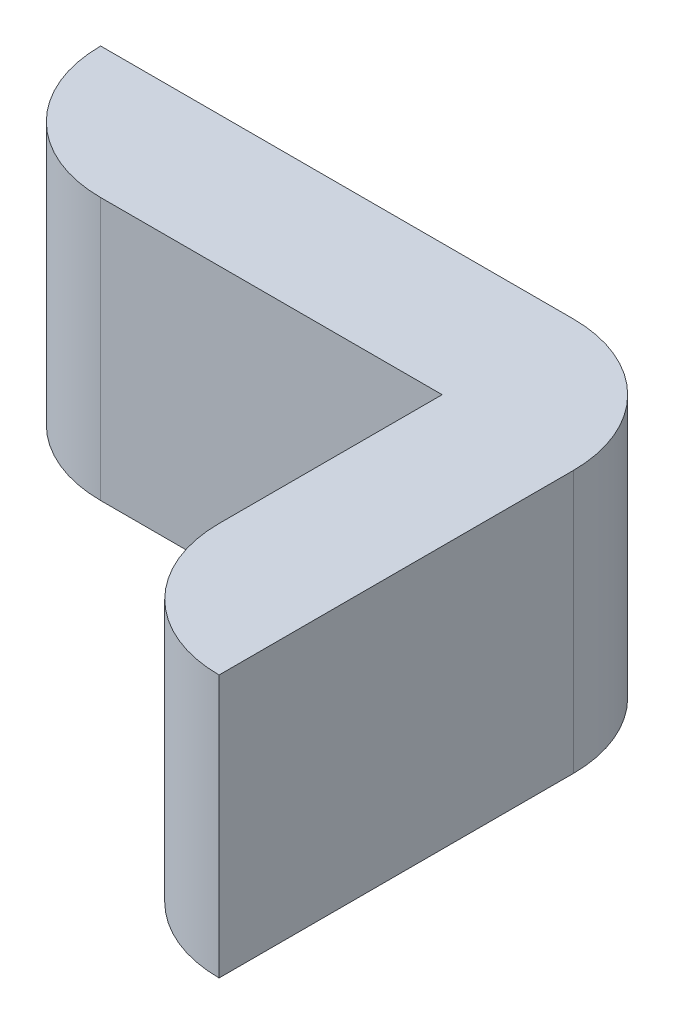
ISO-10303-21;
HEADER;
FILE_DESCRIPTION(('STEP AP214'),'2;1');
FILE_NAME('part.step','',(''),(''),'','','');
FILE_SCHEMA(('AUTOMOTIVE_DESIGN { 1 0 10303 214 1 1 1 1 }'));
ENDSEC;
DATA;
#1=APPLICATION_CONTEXT('core data for automotive mechanical design processes');
#2=APPLICATION_PROTOCOL_DEFINITION('international standard','automotive_design',2000,#1);
#3=PRODUCT_CONTEXT('',#1,'mechanical');
#4=PRODUCT('Part','Part','',(#3));
#5=PRODUCT_RELATED_PRODUCT_CATEGORY('part','',(#4));
#6=PRODUCT_DEFINITION_FORMATION('','',#4);
#7=PRODUCT_DEFINITION_CONTEXT('part definition',#1,'design');
#8=PRODUCT_DEFINITION('design','',#6,#7);
#9=PRODUCT_DEFINITION_SHAPE('','',#8);
#10=(LENGTH_UNIT() NAMED_UNIT(*) SI_UNIT(.MILLI.,.METRE.));
#11=(NAMED_UNIT(*) PLANE_ANGLE_UNIT() SI_UNIT($,.RADIAN.));
#12=(NAMED_UNIT(*) SI_UNIT($,.STERADIAN.) SOLID_ANGLE_UNIT());
#13=UNCERTAINTY_MEASURE_WITH_UNIT(LENGTH_MEASURE(1.E-05),#10,'distance_accuracy_value','');
#14=(GEOMETRIC_REPRESENTATION_CONTEXT(3) GLOBAL_UNCERTAINTY_ASSIGNED_CONTEXT((#13)) GLOBAL_UNIT_ASSIGNED_CONTEXT((#10,
#11,#12)) REPRESENTATION_CONTEXT('',''));
#15=CARTESIAN_POINT('',(0.,0.,0.));
#16=DIRECTION('',(0.,0.,1.));
#17=DIRECTION('',(1.,0.,0.));
#18=AXIS2_PLACEMENT_3D('',#15,#16,#17);
#19=CARTESIAN_POINT('',(0.521041119299,1.0414,0.4699));
#20=DIRECTION('',(-1.,0.,0.));
#21=DIRECTION('',(0.,0.,1.));
#22=AXIS2_PLACEMENT_3D('',#19,#20,#21);
#23=PLANE('',#22);
#24=DIRECTION('',(0.,0.,-1.));
#25=VECTOR('',#24,1.);
#26=CARTESIAN_POINT('',(0.521041119299,1.0414,0.));
#27=LINE('',#26,#25);
#28=CARTESIAN_POINT('',(0.521041119299,1.0414,0.127));
#29=VERTEX_POINT('',#28);
#30=CARTESIAN_POINT('',(0.521041119299,1.0414,0.4699));
#31=VERTEX_POINT('',#30);
#32=EDGE_CURVE('E129',#29,#31,#27,.F.);
#33=ORIENTED_EDGE('',*,*,#32,.F.);
#34=DIRECTION('',(0.,-1.,0.));
#35=VECTOR('',#34,1.);
#36=CARTESIAN_POINT('',(0.521041119299,1.0414,0.127));
#37=LINE('',#36,#35);
#38=CARTESIAN_POINT('',(0.521041119299,1.2954,0.127));
#39=VERTEX_POINT('',#38);
#40=EDGE_CURVE('E82',#39,#29,#37,.T.);
#41=ORIENTED_EDGE('',*,*,#40,.F.);
#42=DIRECTION('',(0.,0.,-1.));
#43=VECTOR('',#42,1.);
#44=CARTESIAN_POINT('',(0.521041119299,1.2954,0.));
#45=LINE('',#44,#43);
#46=CARTESIAN_POINT('',(0.521041119299,1.2954,0.4699));
#47=VERTEX_POINT('',#46);
#48=EDGE_CURVE('E77',#39,#47,#45,.F.);
#49=ORIENTED_EDGE('',*,*,#48,.T.);
#50=DIRECTION('',(0.,-1.,0.));
#51=VECTOR('',#50,1.);
#52=CARTESIAN_POINT('',(0.521041119299,1.0414,0.4699));
#53=LINE('',#52,#51);
#54=EDGE_CURVE('E123',#31,#47,#53,.F.);
#55=ORIENTED_EDGE('',*,*,#54,.F.);
#56=EDGE_LOOP('',(#33,#41,#49,#55));
#57=FACE_BOUND('',#56,.T.);
#58=ADVANCED_FACE('F17',(#57),#23,.F.);
#59=CARTESIAN_POINT('',(0.521041119299,1.0414,0.3429));
#60=DIRECTION('',(0.,-1.,0.));
#61=DIRECTION('',(0.,0.,-1.));
#62=AXIS2_PLACEMENT_3D('',#59,#60,#61);
#63=CYLINDRICAL_SURFACE('',#62,0.127);
#64=CARTESIAN_POINT('',(0.521041119299,1.2954,0.3429));
#65=DIRECTION('',(0.,-1.,0.));
#66=DIRECTION('',(0.,0.,-1.));
#67=AXIS2_PLACEMENT_3D('',#64,#65,#66);
#68=CIRCLE('',#67,0.127);
#69=CARTESIAN_POINT('',(0.394041119299,1.2954,0.3429));
#70=VERTEX_POINT('',#69);
#71=EDGE_CURVE('E107',#47,#70,#68,.T.);
#72=ORIENTED_EDGE('',*,*,#71,.T.);
#73=DIRECTION('',(0.,1.,0.));
#74=VECTOR('',#73,1.);
#75=CARTESIAN_POINT('',(0.394041119299,1.0414,0.3429));
#76=LINE('',#75,#74);
#77=CARTESIAN_POINT('',(0.394041119299,1.0414,0.3429));
#78=VERTEX_POINT('',#77);
#79=EDGE_CURVE('E118',#70,#78,#76,.F.);
#80=ORIENTED_EDGE('',*,*,#79,.T.);
#81=CARTESIAN_POINT('',(0.521041119299,1.0414,0.3429));
#82=DIRECTION('',(0.,-1.,0.));
#83=DIRECTION('',(0.,0.,-1.));
#84=AXIS2_PLACEMENT_3D('',#81,#82,#83);
#85=CIRCLE('',#84,0.127);
#86=EDGE_CURVE('E126',#31,#78,#85,.T.);
#87=ORIENTED_EDGE('',*,*,#86,.F.);
#88=ORIENTED_EDGE('',*,*,#54,.T.);
#89=EDGE_LOOP('',(#72,#80,#87,#88));
#90=FACE_BOUND('',#89,.T.);
#91=ADVANCED_FACE('F133',(#90),#63,.T.);
#92=CARTESIAN_POINT('',(0.394041119299,1.0414,0.127));
#93=DIRECTION('',(1.,0.,0.));
#94=DIRECTION('',(0.,0.,-1.));
#95=AXIS2_PLACEMENT_3D('',#92,#93,#94);
#96=PLANE('',#95);
#97=ORIENTED_EDGE('',*,*,#79,.F.);
#98=DIRECTION('',(0.,0.,-1.));
#99=VECTOR('',#98,1.);
#100=CARTESIAN_POINT('',(0.394041119299,1.2954,0.));
#101=LINE('',#100,#99);
#102=CARTESIAN_POINT('',(0.394041119299,1.2954,0.127));
#103=VERTEX_POINT('',#102);
#104=EDGE_CURVE('E102',#70,#103,#101,.T.);
#105=ORIENTED_EDGE('',*,*,#104,.T.);
#106=DIRECTION('',(0.,1.,0.));
#107=VECTOR('',#106,1.);
#108=CARTESIAN_POINT('',(0.394041119299,1.0414,0.127));
#109=LINE('',#108,#107);
#110=CARTESIAN_POINT('',(0.394041119299,1.0414,0.127));
#111=VERTEX_POINT('',#110);
#112=EDGE_CURVE('E115',#103,#111,#109,.F.);
#113=ORIENTED_EDGE('',*,*,#112,.T.);
#114=DIRECTION('',(0.,0.,-1.));
#115=VECTOR('',#114,1.);
#116=CARTESIAN_POINT('',(0.394041119299,1.0414,0.));
#117=LINE('',#116,#115);
#118=EDGE_CURVE('E128',#78,#111,#117,.T.);
#119=ORIENTED_EDGE('',*,*,#118,.F.);
#120=EDGE_LOOP('',(#97,#105,#113,#119));
#121=FACE_BOUND('',#120,.T.);
#122=ADVANCED_FACE('F158',(#121),#96,.F.);
#123=CARTESIAN_POINT('',(0.0635,1.0414,0.127));
#124=DIRECTION('',(0.,0.,-1.));
#125=DIRECTION('',(-1.,0.,0.));
#126=AXIS2_PLACEMENT_3D('',#123,#124,#125);
#127=PLANE('',#126);
#128=ORIENTED_EDGE('',*,*,#112,.F.);
#129=DIRECTION('',(1.,0.,0.));
#130=VECTOR('',#129,1.);
#131=CARTESIAN_POINT('',(-0.0635,1.2954,0.127));
#132=LINE('',#131,#130);
#133=CARTESIAN_POINT('',(0.0635,1.2954,0.127));
#134=VERTEX_POINT('',#133);
#135=EDGE_CURVE('E98',#103,#134,#132,.F.);
#136=ORIENTED_EDGE('',*,*,#135,.T.);
#137=DIRECTION('',(0.,-1.,0.));
#138=VECTOR('',#137,1.);
#139=CARTESIAN_POINT('',(0.0635,1.0414,0.127));
#140=LINE('',#139,#138);
#141=CARTESIAN_POINT('',(0.0635,1.0414,0.127));
#142=VERTEX_POINT('',#141);
#143=EDGE_CURVE('E101',#142,#134,#140,.F.);
#144=ORIENTED_EDGE('',*,*,#143,.F.);
#145=DIRECTION('',(1.,0.,0.));
#146=VECTOR('',#145,1.);
#147=CARTESIAN_POINT('',(-0.0635,1.0414,0.127));
#148=LINE('',#147,#146);
#149=EDGE_CURVE('E94',#111,#142,#148,.F.);
#150=ORIENTED_EDGE('',*,*,#149,.F.);
#151=EDGE_LOOP('',(#128,#136,#144,#150));
#152=FACE_BOUND('',#151,.T.);
#153=ADVANCED_FACE('F156',(#152),#127,.F.);
#154=CARTESIAN_POINT('',(0.394041119299,1.0414,0.127));
#155=DIRECTION('',(0.,-1.,0.));
#156=DIRECTION('',(0.,0.,-1.));
#157=AXIS2_PLACEMENT_3D('',#154,#155,#156);
#158=CYLINDRICAL_SURFACE('',#157,0.127);
#159=CARTESIAN_POINT('',(0.394041119299,1.2954,0.127));
#160=DIRECTION('',(0.,-1.,0.));
#161=DIRECTION('',(0.,0.,-1.));
#162=AXIS2_PLACEMENT_3D('',#159,#160,#161);
#163=CIRCLE('',#162,0.127);
#164=CARTESIAN_POINT('',(0.394041119299,1.2954,0.));
#165=VERTEX_POINT('',#164);
#166=EDGE_CURVE('E20',#165,#39,#163,.T.);
#167=ORIENTED_EDGE('',*,*,#166,.T.);
#168=ORIENTED_EDGE('',*,*,#40,.T.);
#169=CARTESIAN_POINT('',(0.394041119299,1.0414,0.127));
#170=DIRECTION('',(0.,-1.,0.));
#171=DIRECTION('',(0.,0.,-1.));
#172=AXIS2_PLACEMENT_3D('',#169,#170,#171);
#173=CIRCLE('',#172,0.127);
#174=CARTESIAN_POINT('',(0.394041119299,1.0414,0.));
#175=VERTEX_POINT('',#174);
#176=EDGE_CURVE('E92',#175,#29,#173,.T.);
#177=ORIENTED_EDGE('',*,*,#176,.F.);
#178=DIRECTION('',(0.,1.,0.));
#179=VECTOR('',#178,1.);
#180=CARTESIAN_POINT('',(0.394041119299,1.0414,0.));
#181=LINE('',#180,#179);
#182=EDGE_CURVE('E86',#175,#165,#181,.T.);
#183=ORIENTED_EDGE('',*,*,#182,.T.);
#184=EDGE_LOOP('',(#167,#168,#177,#183));
#185=FACE_BOUND('',#184,.T.);
#186=ADVANCED_FACE('F90',(#185),#158,.T.);
#187=CARTESIAN_POINT('',(-0.0635,1.2954,0.));
#188=DIRECTION('',(0.,-1.,0.));
#189=DIRECTION('',(0.,0.,-1.));
#190=AXIS2_PLACEMENT_3D('',#187,#188,#189);
#191=PLANE('',#190);
#192=ORIENTED_EDGE('',*,*,#135,.F.);
#193=ORIENTED_EDGE('',*,*,#104,.F.);
#194=ORIENTED_EDGE('',*,*,#71,.F.);
#195=ORIENTED_EDGE('',*,*,#48,.F.);
#196=ORIENTED_EDGE('',*,*,#166,.F.);
#197=DIRECTION('',(1.,0.,0.));
#198=VECTOR('',#197,1.);
#199=CARTESIAN_POINT('',(0.394041119299,1.2954,0.));
#200=LINE('',#199,#198);
#201=CARTESIAN_POINT('',(-0.0635,1.2954,0.));
#202=VERTEX_POINT('',#201);
#203=EDGE_CURVE('E74',#165,#202,#200,.F.);
#204=ORIENTED_EDGE('',*,*,#203,.T.);
#205=CARTESIAN_POINT('',(0.0635,1.2954,0.));
#206=DIRECTION('',(0.,-1.,0.));
#207=DIRECTION('',(0.,0.,-1.));
#208=AXIS2_PLACEMENT_3D('',#205,#206,#207);
#209=CIRCLE('',#208,0.127);
#210=EDGE_CURVE('E114',#134,#202,#209,.T.);
#211=ORIENTED_EDGE('',*,*,#210,.F.);
#212=EDGE_LOOP('',(#192,#193,#194,#195,#196,#204,#211));
#213=FACE_BOUND('',#212,.T.);
#214=ADVANCED_FACE('F72',(#213),#191,.F.);
#215=CARTESIAN_POINT('',(0.0635,1.0414,0.));
#216=DIRECTION('',(0.,-1.,0.));
#217=DIRECTION('',(0.,0.,-1.));
#218=AXIS2_PLACEMENT_3D('',#215,#216,#217);
#219=CYLINDRICAL_SURFACE('',#218,0.127);
#220=ORIENTED_EDGE('',*,*,#210,.T.);
#221=DIRECTION('',(0.,1.,0.));
#222=VECTOR('',#221,1.);
#223=CARTESIAN_POINT('',(-0.0635,1.0414,0.));
#224=LINE('',#223,#222);
#225=CARTESIAN_POINT('',(-0.0635,1.0414,0.));
#226=VERTEX_POINT('',#225);
#227=EDGE_CURVE('E26',#202,#226,#224,.F.);
#228=ORIENTED_EDGE('',*,*,#227,.T.);
#229=CARTESIAN_POINT('',(0.0635,1.0414,0.));
#230=DIRECTION('',(0.,-1.,0.));
#231=DIRECTION('',(0.,0.,-1.));
#232=AXIS2_PLACEMENT_3D('',#229,#230,#231);
#233=CIRCLE('',#232,0.127);
#234=EDGE_CURVE('E34',#142,#226,#233,.T.);
#235=ORIENTED_EDGE('',*,*,#234,.F.);
#236=ORIENTED_EDGE('',*,*,#143,.T.);
#237=EDGE_LOOP('',(#220,#228,#235,#236));
#238=FACE_BOUND('',#237,.T.);
#239=ADVANCED_FACE('F141',(#238),#219,.T.);
#240=CARTESIAN_POINT('',(-0.0635,1.0414,0.));
#241=DIRECTION('',(0.,-1.,0.));
#242=DIRECTION('',(0.,0.,-1.));
#243=AXIS2_PLACEMENT_3D('',#240,#241,#242);
#244=PLANE('',#243);
#245=ORIENTED_EDGE('',*,*,#149,.T.);
#246=ORIENTED_EDGE('',*,*,#234,.T.);
#247=DIRECTION('',(1.,0.,0.));
#248=VECTOR('',#247,1.);
#249=CARTESIAN_POINT('',(0.394041119299,1.0414,0.));
#250=LINE('',#249,#248);
#251=EDGE_CURVE('E11',#226,#175,#250,.T.);
#252=ORIENTED_EDGE('',*,*,#251,.T.);
#253=ORIENTED_EDGE('',*,*,#176,.T.);
#254=ORIENTED_EDGE('',*,*,#32,.T.);
#255=ORIENTED_EDGE('',*,*,#86,.T.);
#256=ORIENTED_EDGE('',*,*,#118,.T.);
#257=EDGE_LOOP('',(#245,#246,#252,#253,#254,#255,#256));
#258=FACE_BOUND('',#257,.T.);
#259=ADVANCED_FACE('F139',(#258),#244,.T.);
#260=CARTESIAN_POINT('',(0.394041119299,1.0414,0.));
#261=DIRECTION('',(0.,0.,1.));
#262=DIRECTION('',(1.,0.,0.));
#263=AXIS2_PLACEMENT_3D('',#260,#261,#262);
#264=PLANE('',#263);
#265=ORIENTED_EDGE('',*,*,#227,.F.);
#266=ORIENTED_EDGE('',*,*,#203,.F.);
#267=ORIENTED_EDGE('',*,*,#182,.F.);
#268=ORIENTED_EDGE('',*,*,#251,.F.);
#269=EDGE_LOOP('',(#265,#266,#267,#268));
#270=FACE_BOUND('',#269,.T.);
#271=ADVANCED_FACE('F85',(#270),#264,.F.);
#272=CLOSED_SHELL('',(#58,#91,#122,#153,#186,#214,#239,#259,#271));
#273=MANIFOLD_SOLID_BREP('B1',#272);
#274=ADVANCED_BREP_SHAPE_REPRESENTATION('',(#18,#273),#14);
#275=SHAPE_DEFINITION_REPRESENTATION(#9,#274);
ENDSEC;
END-ISO-10303-21;
